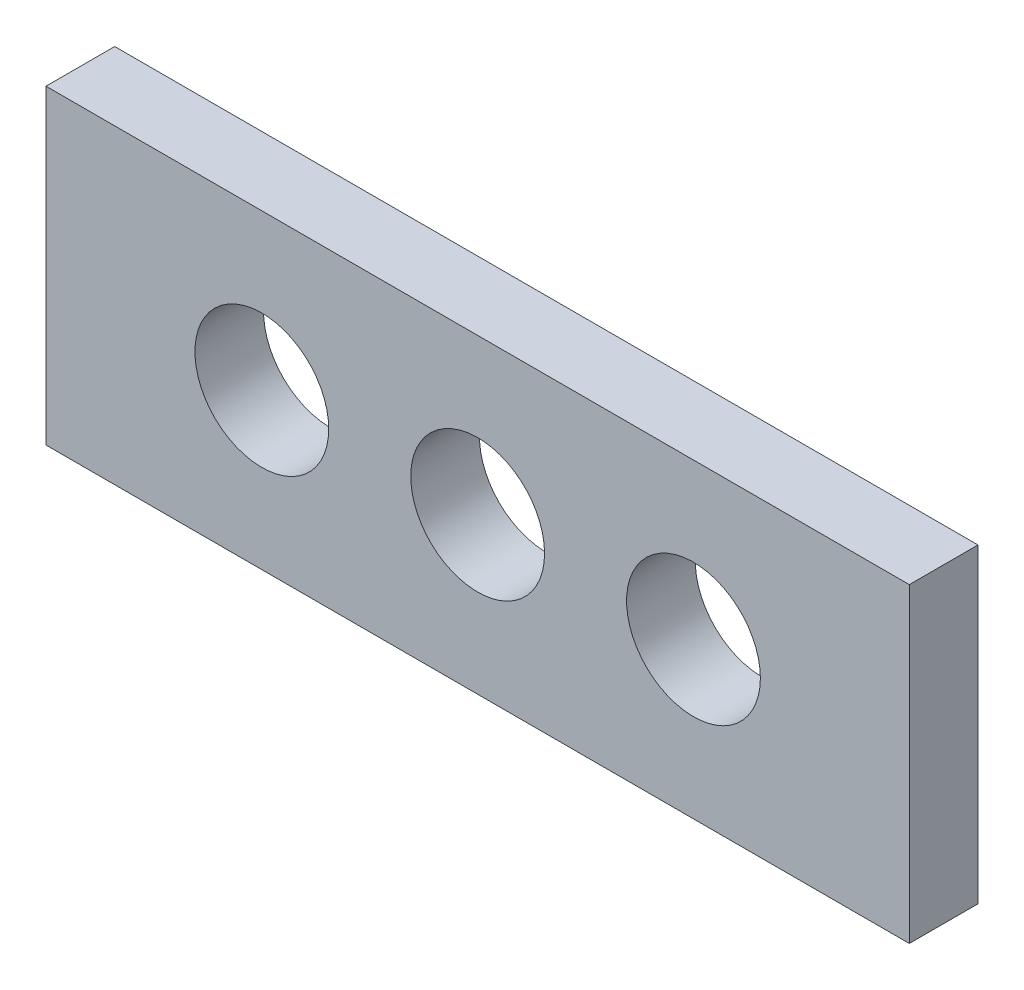
ISO-10303-21;
HEADER;
FILE_DESCRIPTION(('STEP AP214'),'2;1');
FILE_NAME('part.step','',(''),(''),'','','');
FILE_SCHEMA(('AUTOMOTIVE_DESIGN { 1 0 10303 214 1 1 1 1 }'));
ENDSEC;
DATA;
#1=APPLICATION_CONTEXT('core data for automotive mechanical design processes');
#2=APPLICATION_PROTOCOL_DEFINITION('international standard','automotive_design',2000,#1);
#3=PRODUCT_CONTEXT('',#1,'mechanical');
#4=PRODUCT('Part','Part','',(#3));
#5=PRODUCT_RELATED_PRODUCT_CATEGORY('part','',(#4));
#6=PRODUCT_DEFINITION_FORMATION('','',#4);
#7=PRODUCT_DEFINITION_CONTEXT('part definition',#1,'design');
#8=PRODUCT_DEFINITION('design','',#6,#7);
#9=PRODUCT_DEFINITION_SHAPE('','',#8);
#10=(LENGTH_UNIT() NAMED_UNIT(*) SI_UNIT(.MILLI.,.METRE.));
#11=(NAMED_UNIT(*) PLANE_ANGLE_UNIT() SI_UNIT($,.RADIAN.));
#12=(NAMED_UNIT(*) SI_UNIT($,.STERADIAN.) SOLID_ANGLE_UNIT());
#13=UNCERTAINTY_MEASURE_WITH_UNIT(LENGTH_MEASURE(1.E-05),#10,'distance_accuracy_value','');
#14=(GEOMETRIC_REPRESENTATION_CONTEXT(3) GLOBAL_UNCERTAINTY_ASSIGNED_CONTEXT((#13)) GLOBAL_UNIT_ASSIGNED_CONTEXT((#10,
#11,#12)) REPRESENTATION_CONTEXT('',''));
#15=CARTESIAN_POINT('',(0.,0.,0.));
#16=DIRECTION('',(0.,0.,1.));
#17=DIRECTION('',(1.,0.,0.));
#18=AXIS2_PLACEMENT_3D('',#15,#16,#17);
#19=CARTESIAN_POINT('',(0.,0.,-1.59143954));
#20=DIRECTION('',(0.,1.,0.));
#21=DIRECTION('',(1.,0.,0.));
#22=AXIS2_PLACEMENT_3D('',#19,#20,#21);
#23=PLANE('',#22);
#24=DIRECTION('',(1.,0.,0.));
#25=VECTOR('',#24,1.);
#26=CARTESIAN_POINT('',(0.,0.,-1.59143954));
#27=LINE('',#26,#25);
#28=CARTESIAN_POINT('',(0.,0.,-1.59143954));
#29=VERTEX_POINT('',#28);
#30=CARTESIAN_POINT('',(20.,0.,-1.59143954));
#31=VERTEX_POINT('',#30);
#32=EDGE_CURVE('E12',#29,#31,#27,.T.);
#33=ORIENTED_EDGE('',*,*,#32,.T.);
#34=DIRECTION('',(0.,0.,1.));
#35=VECTOR('',#34,1.);
#36=CARTESIAN_POINT('',(20.,0.,-1.59143954));
#37=LINE('',#36,#35);
#38=CARTESIAN_POINT('',(20.,0.,0.));
#39=VERTEX_POINT('',#38);
#40=EDGE_CURVE('E28',#31,#39,#37,.T.);
#41=ORIENTED_EDGE('',*,*,#40,.T.);
#42=DIRECTION('',(1.,0.,0.));
#43=VECTOR('',#42,1.);
#44=CARTESIAN_POINT('',(0.,0.,0.));
#45=LINE('',#44,#43);
#46=CARTESIAN_POINT('',(0.,0.,0.));
#47=VERTEX_POINT('',#46);
#48=EDGE_CURVE('E126',#47,#39,#45,.T.);
#49=ORIENTED_EDGE('',*,*,#48,.F.);
#50=DIRECTION('',(0.,0.,1.));
#51=VECTOR('',#50,1.);
#52=CARTESIAN_POINT('',(0.,0.,-1.59143954));
#53=LINE('',#52,#51);
#54=EDGE_CURVE('E40',#29,#47,#53,.T.);
#55=ORIENTED_EDGE('',*,*,#54,.F.);
#56=EDGE_LOOP('',(#33,#41,#49,#55));
#57=FACE_BOUND('',#56,.T.);
#58=ADVANCED_FACE('F19',(#57),#23,.F.);
#59=CARTESIAN_POINT('',(20.,0.,-1.59143954));
#60=DIRECTION('',(-1.,0.,0.));
#61=DIRECTION('',(0.,1.,0.));
#62=AXIS2_PLACEMENT_3D('',#59,#60,#61);
#63=PLANE('',#62);
#64=DIRECTION('',(0.,1.,0.));
#65=VECTOR('',#64,1.);
#66=CARTESIAN_POINT('',(20.,0.,-1.59143954));
#67=LINE('',#66,#65);
#68=CARTESIAN_POINT('',(20.,7.199999809265,-1.59143954));
#69=VERTEX_POINT('',#68);
#70=EDGE_CURVE('E123',#31,#69,#67,.T.);
#71=ORIENTED_EDGE('',*,*,#70,.T.);
#72=DIRECTION('',(0.,0.,1.));
#73=VECTOR('',#72,1.);
#74=CARTESIAN_POINT('',(20.,7.199999809265,-1.59143954));
#75=LINE('',#74,#73);
#76=CARTESIAN_POINT('',(20.,7.199999809265,0.));
#77=VERTEX_POINT('',#76);
#78=EDGE_CURVE('E120',#69,#77,#75,.T.);
#79=ORIENTED_EDGE('',*,*,#78,.T.);
#80=DIRECTION('',(0.,1.,0.));
#81=VECTOR('',#80,1.);
#82=CARTESIAN_POINT('',(20.,0.,0.));
#83=LINE('',#82,#81);
#84=EDGE_CURVE('E118',#39,#77,#83,.T.);
#85=ORIENTED_EDGE('',*,*,#84,.F.);
#86=ORIENTED_EDGE('',*,*,#40,.F.);
#87=EDGE_LOOP('',(#71,#79,#85,#86));
#88=FACE_BOUND('',#87,.T.);
#89=ADVANCED_FACE('F128',(#88),#63,.F.);
#90=CARTESIAN_POINT('',(20.,7.199999809265,-1.59143954));
#91=DIRECTION('',(0.,-1.,0.));
#92=DIRECTION('',(-1.,0.,0.));
#93=AXIS2_PLACEMENT_3D('',#90,#91,#92);
#94=PLANE('',#93);
#95=DIRECTION('',(-1.,0.,0.));
#96=VECTOR('',#95,1.);
#97=CARTESIAN_POINT('',(20.,7.199999809265,-1.59143954));
#98=LINE('',#97,#96);
#99=CARTESIAN_POINT('',(0.,7.199999809265,-1.59143954));
#100=VERTEX_POINT('',#99);
#101=EDGE_CURVE('E115',#69,#100,#98,.T.);
#102=ORIENTED_EDGE('',*,*,#101,.T.);
#103=DIRECTION('',(0.,0.,1.));
#104=VECTOR('',#103,1.);
#105=CARTESIAN_POINT('',(0.,7.199999809265,-1.59143954));
#106=LINE('',#105,#104);
#107=CARTESIAN_POINT('',(0.,7.199999809265,0.));
#108=VERTEX_POINT('',#107);
#109=EDGE_CURVE('E112',#100,#108,#106,.T.);
#110=ORIENTED_EDGE('',*,*,#109,.T.);
#111=DIRECTION('',(-1.,0.,0.));
#112=VECTOR('',#111,1.);
#113=CARTESIAN_POINT('',(20.,7.199999809265,0.));
#114=LINE('',#113,#112);
#115=EDGE_CURVE('E110',#77,#108,#114,.T.);
#116=ORIENTED_EDGE('',*,*,#115,.F.);
#117=ORIENTED_EDGE('',*,*,#78,.F.);
#118=EDGE_LOOP('',(#102,#110,#116,#117));
#119=FACE_BOUND('',#118,.T.);
#120=ADVANCED_FACE('F141',(#119),#94,.F.);
#121=CARTESIAN_POINT('',(0.,7.199999809265,-1.59143954));
#122=DIRECTION('',(1.,0.,0.));
#123=DIRECTION('',(0.,-1.,0.));
#124=AXIS2_PLACEMENT_3D('',#121,#122,#123);
#125=PLANE('',#124);
#126=DIRECTION('',(0.,-1.,0.));
#127=VECTOR('',#126,1.);
#128=CARTESIAN_POINT('',(0.,7.199999809265,-1.59143954));
#129=LINE('',#128,#127);
#130=EDGE_CURVE('E105',#100,#29,#129,.T.);
#131=ORIENTED_EDGE('',*,*,#130,.T.);
#132=ORIENTED_EDGE('',*,*,#54,.T.);
#133=DIRECTION('',(0.,-1.,0.));
#134=VECTOR('',#133,1.);
#135=CARTESIAN_POINT('',(0.,7.199999809265,0.));
#136=LINE('',#135,#134);
#137=EDGE_CURVE('E103',#108,#47,#136,.T.);
#138=ORIENTED_EDGE('',*,*,#137,.F.);
#139=ORIENTED_EDGE('',*,*,#109,.F.);
#140=EDGE_LOOP('',(#131,#132,#138,#139));
#141=FACE_BOUND('',#140,.T.);
#142=ADVANCED_FACE('F135',(#141),#125,.F.);
#143=CARTESIAN_POINT('',(5.00000016,3.60000042,-1.59143954));
#144=DIRECTION('',(0.,0.,-1.));
#145=DIRECTION('',(1.,0.,0.));
#146=AXIS2_PLACEMENT_3D('',#143,#144,#145);
#147=CYLINDRICAL_SURFACE('',#146,1.54999944);
#148=DIRECTION('',(0.,0.,1.));
#149=VECTOR('',#148,1.);
#150=CARTESIAN_POINT('',(6.5499996,3.60000042,-1.59143954));
#151=LINE('',#150,#149);
#152=CARTESIAN_POINT('',(6.5499996,3.60000042,-1.59143954));
#153=VERTEX_POINT('',#152);
#154=CARTESIAN_POINT('',(6.5499996,3.60000042,0.));
#155=VERTEX_POINT('',#154);
#156=EDGE_CURVE('E101',#153,#155,#151,.T.);
#157=ORIENTED_EDGE('',*,*,#156,.T.);
#158=CARTESIAN_POINT('',(5.00000016,3.60000042,0.));
#159=DIRECTION('',(0.,0.,1.));
#160=DIRECTION('',(1.,0.,0.));
#161=AXIS2_PLACEMENT_3D('',#158,#159,#160);
#162=CIRCLE('',#161,1.54999944);
#163=EDGE_CURVE('E98',#155,#155,#162,.T.);
#164=ORIENTED_EDGE('',*,*,#163,.T.);
#165=ORIENTED_EDGE('',*,*,#156,.F.);
#166=CARTESIAN_POINT('',(5.00000016,3.60000042,-1.59143954));
#167=DIRECTION('',(0.,0.,1.));
#168=DIRECTION('',(1.,0.,0.));
#169=AXIS2_PLACEMENT_3D('',#166,#167,#168);
#170=CIRCLE('',#169,1.54999944);
#171=EDGE_CURVE('E96',#153,#153,#170,.T.);
#172=ORIENTED_EDGE('',*,*,#171,.F.);
#173=EDGE_LOOP('',(#157,#164,#165,#172));
#174=FACE_BOUND('',#173,.T.);
#175=ADVANCED_FACE('F149',(#174),#147,.F.);
#176=CARTESIAN_POINT('',(15.00000048,3.60000042,-1.59143954));
#177=DIRECTION('',(0.,0.,-1.));
#178=DIRECTION('',(1.,0.,0.));
#179=AXIS2_PLACEMENT_3D('',#176,#177,#178);
#180=CYLINDRICAL_SURFACE('',#179,1.54999944);
#181=DIRECTION('',(0.,0.,1.));
#182=VECTOR('',#181,1.);
#183=CARTESIAN_POINT('',(16.54999992,3.60000042,-1.59143954));
#184=LINE('',#183,#182);
#185=CARTESIAN_POINT('',(16.54999992,3.60000042,-1.59143954));
#186=VERTEX_POINT('',#185);
#187=CARTESIAN_POINT('',(16.54999992,3.60000042,0.));
#188=VERTEX_POINT('',#187);
#189=EDGE_CURVE('E94',#186,#188,#184,.T.);
#190=ORIENTED_EDGE('',*,*,#189,.T.);
#191=CARTESIAN_POINT('',(15.00000048,3.60000042,0.));
#192=DIRECTION('',(0.,0.,1.));
#193=DIRECTION('',(1.,0.,0.));
#194=AXIS2_PLACEMENT_3D('',#191,#192,#193);
#195=CIRCLE('',#194,1.54999944);
#196=EDGE_CURVE('E91',#188,#188,#195,.T.);
#197=ORIENTED_EDGE('',*,*,#196,.T.);
#198=ORIENTED_EDGE('',*,*,#189,.F.);
#199=CARTESIAN_POINT('',(15.00000048,3.60000042,-1.59143954));
#200=DIRECTION('',(0.,0.,1.));
#201=DIRECTION('',(1.,0.,0.));
#202=AXIS2_PLACEMENT_3D('',#199,#200,#201);
#203=CIRCLE('',#202,1.54999944);
#204=EDGE_CURVE('E89',#186,#186,#203,.T.);
#205=ORIENTED_EDGE('',*,*,#204,.F.);
#206=EDGE_LOOP('',(#190,#197,#198,#205));
#207=FACE_BOUND('',#206,.T.);
#208=ADVANCED_FACE('F182',(#207),#180,.F.);
#209=CARTESIAN_POINT('',(10.00000032,3.60000042,-1.59143954));
#210=DIRECTION('',(0.,0.,-1.));
#211=DIRECTION('',(1.,0.,0.));
#212=AXIS2_PLACEMENT_3D('',#209,#210,#211);
#213=CYLINDRICAL_SURFACE('',#212,1.54999944);
#214=DIRECTION('',(0.,0.,1.));
#215=VECTOR('',#214,1.);
#216=CARTESIAN_POINT('',(11.54999976,3.60000042,-1.59143954));
#217=LINE('',#216,#215);
#218=CARTESIAN_POINT('',(11.54999976,3.60000042,-1.59143954));
#219=VERTEX_POINT('',#218);
#220=CARTESIAN_POINT('',(11.54999976,3.60000042,0.));
#221=VERTEX_POINT('',#220);
#222=EDGE_CURVE('E85',#219,#221,#217,.T.);
#223=ORIENTED_EDGE('',*,*,#222,.T.);
#224=CARTESIAN_POINT('',(10.00000032,3.60000042,0.));
#225=DIRECTION('',(0.,0.,1.));
#226=DIRECTION('',(1.,0.,0.));
#227=AXIS2_PLACEMENT_3D('',#224,#225,#226);
#228=CIRCLE('',#227,1.54999944);
#229=EDGE_CURVE('E82',#221,#221,#228,.T.);
#230=ORIENTED_EDGE('',*,*,#229,.T.);
#231=ORIENTED_EDGE('',*,*,#222,.F.);
#232=CARTESIAN_POINT('',(10.00000032,3.60000042,-1.59143954));
#233=DIRECTION('',(0.,0.,1.));
#234=DIRECTION('',(1.,0.,0.));
#235=AXIS2_PLACEMENT_3D('',#232,#233,#234);
#236=CIRCLE('',#235,1.54999944);
#237=EDGE_CURVE('E78',#219,#219,#236,.T.);
#238=ORIENTED_EDGE('',*,*,#237,.F.);
#239=EDGE_LOOP('',(#223,#230,#231,#238));
#240=FACE_BOUND('',#239,.T.);
#241=ADVANCED_FACE('F192',(#240),#213,.F.);
#242=CARTESIAN_POINT('',(0.,0.,-1.59143954));
#243=DIRECTION('',(0.,0.,-1.));
#244=DIRECTION('',(-1.,0.,0.));
#245=AXIS2_PLACEMENT_3D('',#242,#243,#244);
#246=PLANE('',#245);
#247=ORIENTED_EDGE('',*,*,#130,.F.);
#248=ORIENTED_EDGE('',*,*,#101,.F.);
#249=ORIENTED_EDGE('',*,*,#70,.F.);
#250=ORIENTED_EDGE('',*,*,#32,.F.);
#251=EDGE_LOOP('',(#247,#248,#249,#250));
#252=FACE_BOUND('',#251,.T.);
#253=ORIENTED_EDGE('',*,*,#171,.T.);
#254=EDGE_LOOP('',(#253));
#255=FACE_BOUND('',#254,.T.);
#256=ORIENTED_EDGE('',*,*,#204,.T.);
#257=EDGE_LOOP('',(#256));
#258=FACE_BOUND('',#257,.T.);
#259=ORIENTED_EDGE('',*,*,#237,.T.);
#260=EDGE_LOOP('',(#259));
#261=FACE_BOUND('',#260,.T.);
#262=ADVANCED_FACE('F79',(#252,#255,#258,#261),#246,.T.);
#263=CARTESIAN_POINT('',(0.,0.,0.));
#264=DIRECTION('',(0.,0.,-1.));
#265=DIRECTION('',(-1.,0.,0.));
#266=AXIS2_PLACEMENT_3D('',#263,#264,#265);
#267=PLANE('',#266);
#268=ORIENTED_EDGE('',*,*,#48,.T.);
#269=ORIENTED_EDGE('',*,*,#84,.T.);
#270=ORIENTED_EDGE('',*,*,#115,.T.);
#271=ORIENTED_EDGE('',*,*,#137,.T.);
#272=EDGE_LOOP('',(#268,#269,#270,#271));
#273=FACE_BOUND('',#272,.T.);
#274=ORIENTED_EDGE('',*,*,#163,.F.);
#275=EDGE_LOOP('',(#274));
#276=FACE_BOUND('',#275,.T.);
#277=ORIENTED_EDGE('',*,*,#196,.F.);
#278=EDGE_LOOP('',(#277));
#279=FACE_BOUND('',#278,.T.);
#280=ORIENTED_EDGE('',*,*,#229,.F.);
#281=EDGE_LOOP('',(#280));
#282=FACE_BOUND('',#281,.T.);
#283=ADVANCED_FACE('F131',(#273,#276,#279,#282),#267,.F.);
#284=CLOSED_SHELL('',(#58,#89,#120,#142,#175,#208,#241,#262,#283));
#285=MANIFOLD_SOLID_BREP('B1',#284);
#286=ADVANCED_BREP_SHAPE_REPRESENTATION('',(#18,#285),#14);
#287=SHAPE_DEFINITION_REPRESENTATION(#9,#286);
ENDSEC;
END-ISO-10303-21;
